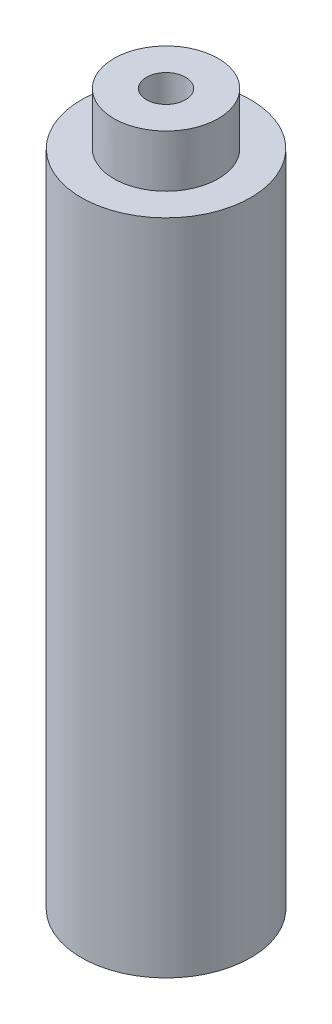
ISO-10303-21;
HEADER;
FILE_DESCRIPTION(('STEP AP214'),'2;1');
FILE_NAME('part.step','',(''),(''),'','','');
FILE_SCHEMA(('AUTOMOTIVE_DESIGN { 1 0 10303 214 1 1 1 1 }'));
ENDSEC;
DATA;
#1=APPLICATION_CONTEXT('core data for automotive mechanical design processes');
#2=APPLICATION_PROTOCOL_DEFINITION('international standard','automotive_design',2000,#1);
#3=PRODUCT_CONTEXT('',#1,'mechanical');
#4=PRODUCT('Part','Part','',(#3));
#5=PRODUCT_RELATED_PRODUCT_CATEGORY('part','',(#4));
#6=PRODUCT_DEFINITION_FORMATION('','',#4);
#7=PRODUCT_DEFINITION_CONTEXT('part definition',#1,'design');
#8=PRODUCT_DEFINITION('design','',#6,#7);
#9=PRODUCT_DEFINITION_SHAPE('','',#8);
#10=(LENGTH_UNIT() NAMED_UNIT(*) SI_UNIT(.MILLI.,.METRE.));
#11=(NAMED_UNIT(*) PLANE_ANGLE_UNIT() SI_UNIT($,.RADIAN.));
#12=(NAMED_UNIT(*) SI_UNIT($,.STERADIAN.) SOLID_ANGLE_UNIT());
#13=UNCERTAINTY_MEASURE_WITH_UNIT(LENGTH_MEASURE(1.E-05),#10,'distance_accuracy_value','');
#14=(GEOMETRIC_REPRESENTATION_CONTEXT(3) GLOBAL_UNCERTAINTY_ASSIGNED_CONTEXT((#13)) GLOBAL_UNIT_ASSIGNED_CONTEXT((#10,
#11,#12)) REPRESENTATION_CONTEXT('',''));
#15=CARTESIAN_POINT('',(0.,0.,0.));
#16=DIRECTION('',(0.,0.,1.));
#17=DIRECTION('',(1.,0.,0.));
#18=AXIS2_PLACEMENT_3D('',#15,#16,#17);
#19=CARTESIAN_POINT('',(0.,-0.25,0.));
#20=DIRECTION('',(0.,-1.,0.));
#21=DIRECTION('',(0.,0.,-1.));
#22=AXIS2_PLACEMENT_3D('',#19,#20,#21);
#23=PLANE('',#22);
#24=CARTESIAN_POINT('',(0.,-0.25,0.));
#25=DIRECTION('',(0.,-1.,0.));
#26=DIRECTION('',(0.,0.,-1.));
#27=AXIS2_PLACEMENT_3D('',#24,#25,#26);
#28=CIRCLE('',#27,0.75);
#29=CARTESIAN_POINT('',(0.,-0.25,-0.75));
#30=VERTEX_POINT('',#29);
#31=EDGE_CURVE('E53',#30,#30,#28,.T.);
#32=ORIENTED_EDGE('',*,*,#31,.F.);
#33=EDGE_LOOP('',(#32));
#34=FACE_BOUND('',#33,.T.);
#35=CARTESIAN_POINT('',(0.,-0.25,0.));
#36=DIRECTION('',(0.,-1.,0.));
#37=DIRECTION('',(0.,0.,-1.));
#38=AXIS2_PLACEMENT_3D('',#35,#36,#37);
#39=CIRCLE('',#38,3.);
#40=CARTESIAN_POINT('',(0.,-0.25,-3.));
#41=VERTEX_POINT('',#40);
#42=EDGE_CURVE('E10',#41,#41,#39,.F.);
#43=ORIENTED_EDGE('',*,*,#42,.F.);
#44=EDGE_LOOP('',(#43));
#45=FACE_BOUND('',#44,.T.);
#46=ADVANCED_FACE('F30',(#34,#45),#23,.T.);
#47=CARTESIAN_POINT('',(0.,2.,0.));
#48=DIRECTION('',(0.,1.,0.));
#49=DIRECTION('',(0.,0.,1.));
#50=AXIS2_PLACEMENT_3D('',#47,#48,#49);
#51=PLANE('',#50);
#52=CARTESIAN_POINT('',(0.,2.,0.));
#53=DIRECTION('',(0.,1.,0.));
#54=DIRECTION('',(0.,0.,1.));
#55=AXIS2_PLACEMENT_3D('',#52,#53,#54);
#56=CIRCLE('',#55,2.);
#57=CARTESIAN_POINT('',(0.,2.,2.));
#58=VERTEX_POINT('',#57);
#59=EDGE_CURVE('E37',#58,#58,#56,.T.);
#60=ORIENTED_EDGE('',*,*,#59,.T.);
#61=EDGE_LOOP('',(#60));
#62=FACE_BOUND('',#61,.T.);
#63=CARTESIAN_POINT('',(0.,2.,0.));
#64=DIRECTION('',(0.,1.,0.));
#65=DIRECTION('',(0.,0.,1.));
#66=AXIS2_PLACEMENT_3D('',#63,#64,#65);
#67=CIRCLE('',#66,0.75);
#68=CARTESIAN_POINT('',(0.,2.,0.75));
#69=VERTEX_POINT('',#68);
#70=EDGE_CURVE('E41',#69,#69,#67,.T.);
#71=ORIENTED_EDGE('',*,*,#70,.F.);
#72=EDGE_LOOP('',(#71));
#73=FACE_BOUND('',#72,.T.);
#74=ADVANCED_FACE('F80',(#62,#73),#51,.T.);
#75=CARTESIAN_POINT('',(0.,2.,0.));
#76=DIRECTION('',(0.,-1.,0.));
#77=DIRECTION('',(0.,0.,-1.));
#78=AXIS2_PLACEMENT_3D('',#75,#76,#77);
#79=CYLINDRICAL_SURFACE('',#78,2.);
#80=ORIENTED_EDGE('',*,*,#59,.F.);
#81=EDGE_LOOP('',(#80));
#82=FACE_BOUND('',#81,.T.);
#83=CARTESIAN_POINT('',(0.,0.,0.));
#84=DIRECTION('',(0.,-1.,0.));
#85=DIRECTION('',(0.,0.,-1.));
#86=AXIS2_PLACEMENT_3D('',#83,#84,#85);
#87=CIRCLE('',#86,2.);
#88=CARTESIAN_POINT('',(0.,0.,-2.));
#89=VERTEX_POINT('',#88);
#90=EDGE_CURVE('E45',#89,#89,#87,.T.);
#91=ORIENTED_EDGE('',*,*,#90,.F.);
#92=EDGE_LOOP('',(#91));
#93=FACE_BOUND('',#92,.T.);
#94=ADVANCED_FACE('F32',(#82,#93),#79,.T.);
#95=CARTESIAN_POINT('',(0.,2.,0.));
#96=DIRECTION('',(0.,-1.,0.));
#97=DIRECTION('',(0.,0.,-1.));
#98=AXIS2_PLACEMENT_3D('',#95,#96,#97);
#99=CYLINDRICAL_SURFACE('',#98,0.75);
#100=ORIENTED_EDGE('',*,*,#70,.T.);
#101=EDGE_LOOP('',(#100));
#102=FACE_BOUND('',#101,.T.);
#103=ORIENTED_EDGE('',*,*,#31,.T.);
#104=EDGE_LOOP('',(#103));
#105=FACE_BOUND('',#104,.T.);
#106=ADVANCED_FACE('F89',(#102,#105),#99,.F.);
#107=CARTESIAN_POINT('',(0.,0.,0.));
#108=DIRECTION('',(0.,-1.,0.));
#109=DIRECTION('',(0.,0.,-1.));
#110=AXIS2_PLACEMENT_3D('',#107,#108,#109);
#111=PLANE('',#110);
#112=CARTESIAN_POINT('',(0.,0.,0.));
#113=DIRECTION('',(0.,-1.,0.));
#114=DIRECTION('',(0.,0.,-1.));
#115=AXIS2_PLACEMENT_3D('',#112,#113,#114);
#116=CIRCLE('',#115,3.25);
#117=CARTESIAN_POINT('',(0.,0.,-3.25));
#118=VERTEX_POINT('',#117);
#119=EDGE_CURVE('E50',#118,#118,#116,.T.);
#120=ORIENTED_EDGE('',*,*,#119,.F.);
#121=EDGE_LOOP('',(#120));
#122=FACE_BOUND('',#121,.T.);
#123=ORIENTED_EDGE('',*,*,#90,.T.);
#124=EDGE_LOOP('',(#123));
#125=FACE_BOUND('',#124,.T.);
#126=ADVANCED_FACE('F75',(#122,#125),#111,.F.);
#127=CARTESIAN_POINT('',(0.,-0.25,0.));
#128=DIRECTION('',(0.,1.,0.));
#129=DIRECTION('',(0.,0.,1.));
#130=AXIS2_PLACEMENT_3D('',#127,#128,#129);
#131=CYLINDRICAL_SURFACE('',#130,3.25);
#132=ORIENTED_EDGE('',*,*,#119,.T.);
#133=EDGE_LOOP('',(#132));
#134=FACE_BOUND('',#133,.T.);
#135=CARTESIAN_POINT('',(0.,-25.25,0.));
#136=DIRECTION('',(0.,-1.,0.));
#137=DIRECTION('',(0.,0.,-1.));
#138=AXIS2_PLACEMENT_3D('',#135,#136,#137);
#139=CIRCLE('',#138,3.25);
#140=CARTESIAN_POINT('',(0.,-25.25,-3.25));
#141=VERTEX_POINT('',#140);
#142=EDGE_CURVE('E56',#141,#141,#139,.T.);
#143=ORIENTED_EDGE('',*,*,#142,.F.);
#144=EDGE_LOOP('',(#143));
#145=FACE_BOUND('',#144,.T.);
#146=ADVANCED_FACE('F67',(#134,#145),#131,.T.);
#147=CARTESIAN_POINT('',(0.,-25.25,0.));
#148=DIRECTION('',(0.,-1.,0.));
#149=DIRECTION('',(0.,0.,-1.));
#150=AXIS2_PLACEMENT_3D('',#147,#148,#149);
#151=PLANE('',#150);
#152=ORIENTED_EDGE('',*,*,#142,.T.);
#153=EDGE_LOOP('',(#152));
#154=FACE_BOUND('',#153,.T.);
#155=CARTESIAN_POINT('',(0.,-25.25,0.));
#156=DIRECTION('',(0.,-1.,0.));
#157=DIRECTION('',(0.,0.,-1.));
#158=AXIS2_PLACEMENT_3D('',#155,#156,#157);
#159=CIRCLE('',#158,3.);
#160=CARTESIAN_POINT('',(0.,-25.25,-3.));
#161=VERTEX_POINT('',#160);
#162=EDGE_CURVE('E59',#161,#161,#159,.T.);
#163=ORIENTED_EDGE('',*,*,#162,.F.);
#164=EDGE_LOOP('',(#163));
#165=FACE_BOUND('',#164,.T.);
#166=ADVANCED_FACE('F65',(#154,#165),#151,.T.);
#167=CARTESIAN_POINT('',(0.,-25.25,0.));
#168=DIRECTION('',(0.,1.,0.));
#169=DIRECTION('',(0.,0.,1.));
#170=AXIS2_PLACEMENT_3D('',#167,#168,#169);
#171=CYLINDRICAL_SURFACE('',#170,3.);
#172=ORIENTED_EDGE('',*,*,#162,.T.);
#173=EDGE_LOOP('',(#172));
#174=FACE_BOUND('',#173,.T.);
#175=ORIENTED_EDGE('',*,*,#42,.T.);
#176=EDGE_LOOP('',(#175));
#177=FACE_BOUND('',#176,.T.);
#178=ADVANCED_FACE('F63',(#174,#177),#171,.F.);
#179=CLOSED_SHELL('',(#46,#74,#94,#106,#126,#146,#166,#178));
#180=MANIFOLD_SOLID_BREP('B2',#179);
#181=ADVANCED_BREP_SHAPE_REPRESENTATION('',(#18,#180),#14);
#182=SHAPE_DEFINITION_REPRESENTATION(#9,#181);
ENDSEC;
END-ISO-10303-21;
